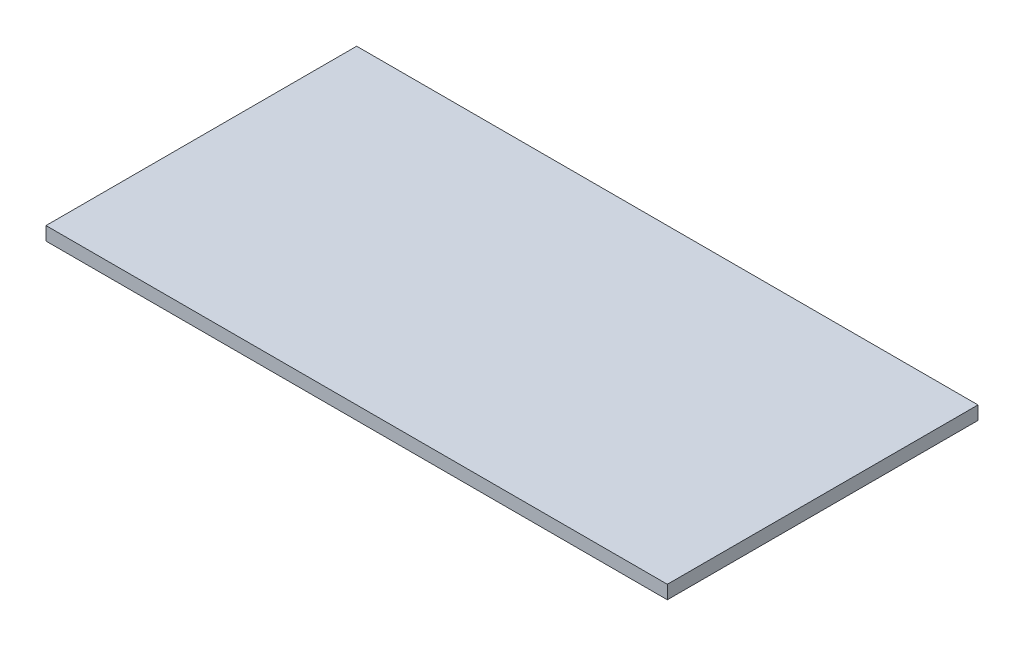
ISO-10303-21;
HEADER;
FILE_DESCRIPTION(('STEP AP214'),'2;1');
FILE_NAME('part.step','',(''),(''),'','','');
FILE_SCHEMA(('AUTOMOTIVE_DESIGN { 1 0 10303 214 1 1 1 1 }'));
ENDSEC;
DATA;
#1=APPLICATION_CONTEXT('core data for automotive mechanical design processes');
#2=APPLICATION_PROTOCOL_DEFINITION('international standard','automotive_design',2000,#1);
#3=PRODUCT_CONTEXT('',#1,'mechanical');
#4=PRODUCT('Part','Part','',(#3));
#5=PRODUCT_RELATED_PRODUCT_CATEGORY('part','',(#4));
#6=PRODUCT_DEFINITION_FORMATION('','',#4);
#7=PRODUCT_DEFINITION_CONTEXT('part definition',#1,'design');
#8=PRODUCT_DEFINITION('design','',#6,#7);
#9=PRODUCT_DEFINITION_SHAPE('','',#8);
#10=(LENGTH_UNIT() NAMED_UNIT(*) SI_UNIT(.MILLI.,.METRE.));
#11=(NAMED_UNIT(*) PLANE_ANGLE_UNIT() SI_UNIT($,.RADIAN.));
#12=(NAMED_UNIT(*) SI_UNIT($,.STERADIAN.) SOLID_ANGLE_UNIT());
#13=UNCERTAINTY_MEASURE_WITH_UNIT(LENGTH_MEASURE(1.E-05),#10,'distance_accuracy_value','');
#14=(GEOMETRIC_REPRESENTATION_CONTEXT(3) GLOBAL_UNCERTAINTY_ASSIGNED_CONTEXT((#13)) GLOBAL_UNIT_ASSIGNED_CONTEXT((#10,
#11,#12)) REPRESENTATION_CONTEXT('',''));
#15=CARTESIAN_POINT('',(0.,0.,0.));
#16=DIRECTION('',(0.,0.,1.));
#17=DIRECTION('',(1.,0.,0.));
#18=AXIS2_PLACEMENT_3D('',#15,#16,#17);
#19=CARTESIAN_POINT('',(-76.2,3.302,38.1));
#20=DIRECTION('',(1.,0.,0.));
#21=DIRECTION('',(0.,0.,-1.));
#22=AXIS2_PLACEMENT_3D('',#19,#20,#21);
#23=PLANE('',#22);
#24=DIRECTION('',(0.,0.,1.));
#25=VECTOR('',#24,1.);
#26=CARTESIAN_POINT('',(-76.2,0.,38.1));
#27=LINE('',#26,#25);
#28=CARTESIAN_POINT('',(-76.2,0.,-38.1));
#29=VERTEX_POINT('',#28);
#30=CARTESIAN_POINT('',(-76.2,0.,38.1));
#31=VERTEX_POINT('',#30);
#32=EDGE_CURVE('E96',#29,#31,#27,.T.);
#33=ORIENTED_EDGE('',*,*,#32,.T.);
#34=DIRECTION('',(0.,-1.,0.));
#35=VECTOR('',#34,1.);
#36=CARTESIAN_POINT('',(-76.2,3.302,38.1));
#37=LINE('',#36,#35);
#38=CARTESIAN_POINT('',(-76.2,3.302,38.1));
#39=VERTEX_POINT('',#38);
#40=EDGE_CURVE('E11',#39,#31,#37,.T.);
#41=ORIENTED_EDGE('',*,*,#40,.F.);
#42=DIRECTION('',(0.,0.,1.));
#43=VECTOR('',#42,1.);
#44=CARTESIAN_POINT('',(-76.2,3.302,38.1));
#45=LINE('',#44,#43);
#46=CARTESIAN_POINT('',(-76.2,3.302,-38.1));
#47=VERTEX_POINT('',#46);
#48=EDGE_CURVE('E84',#47,#39,#45,.T.);
#49=ORIENTED_EDGE('',*,*,#48,.F.);
#50=DIRECTION('',(0.,-1.,0.));
#51=VECTOR('',#50,1.);
#52=CARTESIAN_POINT('',(-76.2,3.302,-38.1));
#53=LINE('',#52,#51);
#54=EDGE_CURVE('E92',#47,#29,#53,.T.);
#55=ORIENTED_EDGE('',*,*,#54,.T.);
#56=EDGE_LOOP('',(#33,#41,#49,#55));
#57=FACE_BOUND('',#56,.T.);
#58=ADVANCED_FACE('F33',(#57),#23,.F.);
#59=CARTESIAN_POINT('',(76.2,3.302,38.1));
#60=DIRECTION('',(0.,0.,-1.));
#61=DIRECTION('',(-1.,0.,0.));
#62=AXIS2_PLACEMENT_3D('',#59,#60,#61);
#63=PLANE('',#62);
#64=DIRECTION('',(1.,0.,0.));
#65=VECTOR('',#64,1.);
#66=CARTESIAN_POINT('',(76.2,0.,38.1));
#67=LINE('',#66,#65);
#68=CARTESIAN_POINT('',(76.2,0.,38.1));
#69=VERTEX_POINT('',#68);
#70=EDGE_CURVE('E88',#31,#69,#67,.T.);
#71=ORIENTED_EDGE('',*,*,#70,.T.);
#72=DIRECTION('',(0.,-1.,0.));
#73=VECTOR('',#72,1.);
#74=CARTESIAN_POINT('',(76.2,3.302,38.1));
#75=LINE('',#74,#73);
#76=CARTESIAN_POINT('',(76.2,3.302,38.1));
#77=VERTEX_POINT('',#76);
#78=EDGE_CURVE('E41',#77,#69,#75,.T.);
#79=ORIENTED_EDGE('',*,*,#78,.F.);
#80=DIRECTION('',(1.,0.,0.));
#81=VECTOR('',#80,1.);
#82=CARTESIAN_POINT('',(76.2,3.302,38.1));
#83=LINE('',#82,#81);
#84=EDGE_CURVE('E79',#39,#77,#83,.T.);
#85=ORIENTED_EDGE('',*,*,#84,.F.);
#86=ORIENTED_EDGE('',*,*,#40,.T.);
#87=EDGE_LOOP('',(#71,#79,#85,#86));
#88=FACE_BOUND('',#87,.T.);
#89=ADVANCED_FACE('F87',(#88),#63,.F.);
#90=CARTESIAN_POINT('',(76.2,3.302,38.1));
#91=DIRECTION('',(-1.,0.,0.));
#92=DIRECTION('',(0.,0.,1.));
#93=AXIS2_PLACEMENT_3D('',#90,#91,#92);
#94=PLANE('',#93);
#95=DIRECTION('',(0.,0.,-1.));
#96=VECTOR('',#95,1.);
#97=CARTESIAN_POINT('',(76.2,0.,38.1));
#98=LINE('',#97,#96);
#99=CARTESIAN_POINT('',(76.2,0.,-38.1));
#100=VERTEX_POINT('',#99);
#101=EDGE_CURVE('E66',#69,#100,#98,.T.);
#102=ORIENTED_EDGE('',*,*,#101,.T.);
#103=DIRECTION('',(0.,-1.,0.));
#104=VECTOR('',#103,1.);
#105=CARTESIAN_POINT('',(76.2,3.302,-38.1));
#106=LINE('',#105,#104);
#107=CARTESIAN_POINT('',(76.2,3.302,-38.1));
#108=VERTEX_POINT('',#107);
#109=EDGE_CURVE('E89',#108,#100,#106,.T.);
#110=ORIENTED_EDGE('',*,*,#109,.F.);
#111=DIRECTION('',(0.,0.,-1.));
#112=VECTOR('',#111,1.);
#113=CARTESIAN_POINT('',(76.2,3.302,38.1));
#114=LINE('',#113,#112);
#115=EDGE_CURVE('E82',#77,#108,#114,.T.);
#116=ORIENTED_EDGE('',*,*,#115,.F.);
#117=ORIENTED_EDGE('',*,*,#78,.T.);
#118=EDGE_LOOP('',(#102,#110,#116,#117));
#119=FACE_BOUND('',#118,.T.);
#120=ADVANCED_FACE('F90',(#119),#94,.F.);
#121=CARTESIAN_POINT('',(76.2,3.302,-38.1));
#122=DIRECTION('',(0.,0.,1.));
#123=DIRECTION('',(1.,0.,0.));
#124=AXIS2_PLACEMENT_3D('',#121,#122,#123);
#125=PLANE('',#124);
#126=DIRECTION('',(-1.,0.,0.));
#127=VECTOR('',#126,1.);
#128=CARTESIAN_POINT('',(76.2,0.,-38.1));
#129=LINE('',#128,#127);
#130=EDGE_CURVE('E72',#100,#29,#129,.T.);
#131=ORIENTED_EDGE('',*,*,#130,.T.);
#132=ORIENTED_EDGE('',*,*,#54,.F.);
#133=DIRECTION('',(-1.,0.,0.));
#134=VECTOR('',#133,1.);
#135=CARTESIAN_POINT('',(76.2,3.302,-38.1));
#136=LINE('',#135,#134);
#137=EDGE_CURVE('E49',#108,#47,#136,.T.);
#138=ORIENTED_EDGE('',*,*,#137,.F.);
#139=ORIENTED_EDGE('',*,*,#109,.T.);
#140=EDGE_LOOP('',(#131,#132,#138,#139));
#141=FACE_BOUND('',#140,.T.);
#142=ADVANCED_FACE('F103',(#141),#125,.F.);
#143=CARTESIAN_POINT('',(0.,3.302,0.));
#144=DIRECTION('',(0.,1.,0.));
#145=DIRECTION('',(0.,0.,1.));
#146=AXIS2_PLACEMENT_3D('',#143,#144,#145);
#147=PLANE('',#146);
#148=ORIENTED_EDGE('',*,*,#48,.T.);
#149=ORIENTED_EDGE('',*,*,#84,.T.);
#150=ORIENTED_EDGE('',*,*,#115,.T.);
#151=ORIENTED_EDGE('',*,*,#137,.T.);
#152=EDGE_LOOP('',(#148,#149,#150,#151));
#153=FACE_BOUND('',#152,.T.);
#154=ADVANCED_FACE('F80',(#153),#147,.T.);
#155=CARTESIAN_POINT('',(0.,0.,0.));
#156=DIRECTION('',(0.,1.,0.));
#157=DIRECTION('',(0.,0.,1.));
#158=AXIS2_PLACEMENT_3D('',#155,#156,#157);
#159=PLANE('',#158);
#160=ORIENTED_EDGE('',*,*,#32,.F.);
#161=ORIENTED_EDGE('',*,*,#130,.F.);
#162=ORIENTED_EDGE('',*,*,#101,.F.);
#163=ORIENTED_EDGE('',*,*,#70,.F.);
#164=EDGE_LOOP('',(#160,#161,#162,#163));
#165=FACE_BOUND('',#164,.T.);
#166=ADVANCED_FACE('F106',(#165),#159,.F.);
#167=CLOSED_SHELL('',(#58,#89,#120,#142,#154,#166));
#168=MANIFOLD_SOLID_BREP('B2',#167);
#169=ADVANCED_BREP_SHAPE_REPRESENTATION('',(#18,#168),#14);
#170=SHAPE_DEFINITION_REPRESENTATION(#9,#169);
ENDSEC;
END-ISO-10303-21;
